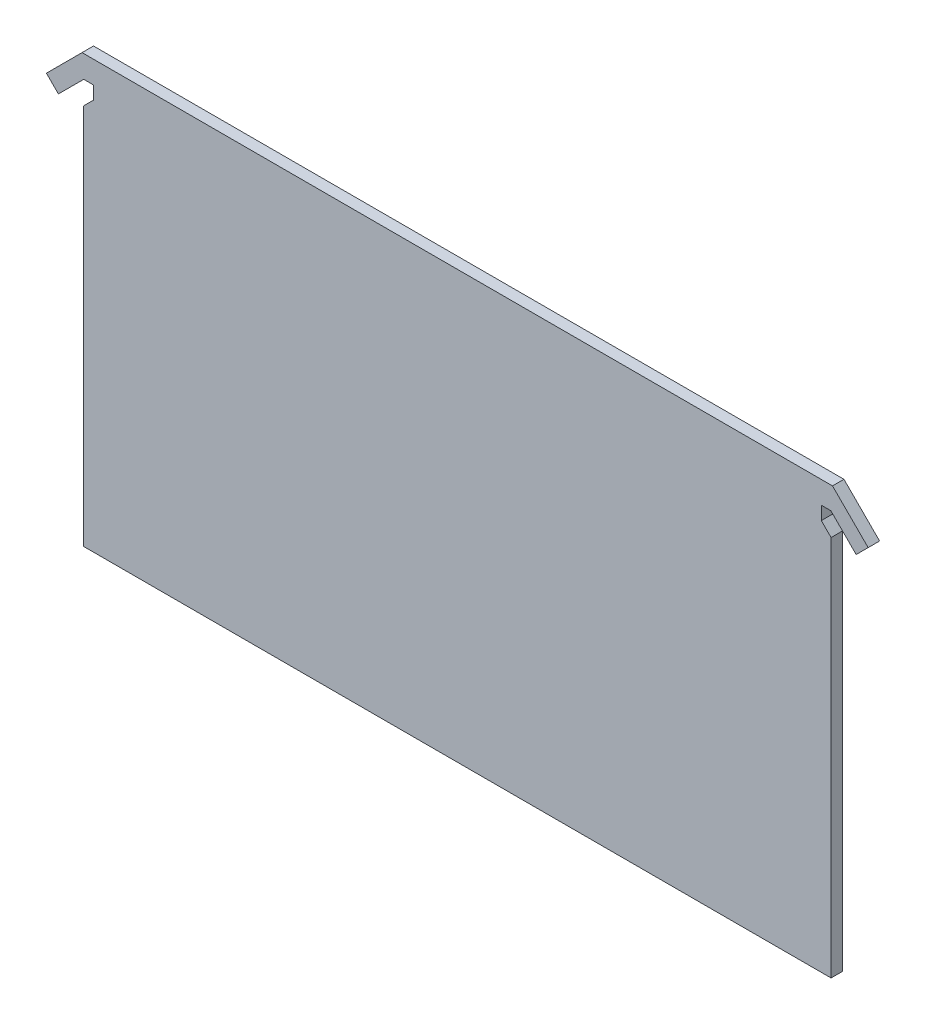
ISO-10303-21;
HEADER;
FILE_DESCRIPTION(('STEP AP214'),'2;1');
FILE_NAME('part.step','',(''),(''),'','','');
FILE_SCHEMA(('AUTOMOTIVE_DESIGN { 1 0 10303 214 1 1 1 1 }'));
ENDSEC;
DATA;
#1=APPLICATION_CONTEXT('core data for automotive mechanical design processes');
#2=APPLICATION_PROTOCOL_DEFINITION('international standard','automotive_design',2000,#1);
#3=PRODUCT_CONTEXT('',#1,'mechanical');
#4=PRODUCT('Part','Part','',(#3));
#5=PRODUCT_RELATED_PRODUCT_CATEGORY('part','',(#4));
#6=PRODUCT_DEFINITION_FORMATION('','',#4);
#7=PRODUCT_DEFINITION_CONTEXT('part definition',#1,'design');
#8=PRODUCT_DEFINITION('design','',#6,#7);
#9=PRODUCT_DEFINITION_SHAPE('','',#8);
#10=(LENGTH_UNIT() NAMED_UNIT(*) SI_UNIT(.MILLI.,.METRE.));
#11=(NAMED_UNIT(*) PLANE_ANGLE_UNIT() SI_UNIT($,.RADIAN.));
#12=(NAMED_UNIT(*) SI_UNIT($,.STERADIAN.) SOLID_ANGLE_UNIT());
#13=UNCERTAINTY_MEASURE_WITH_UNIT(LENGTH_MEASURE(1.E-05),#10,'distance_accuracy_value','');
#14=(GEOMETRIC_REPRESENTATION_CONTEXT(3) GLOBAL_UNCERTAINTY_ASSIGNED_CONTEXT((#13)) GLOBAL_UNIT_ASSIGNED_CONTEXT((#10,
#11,#12)) REPRESENTATION_CONTEXT('',''));
#15=CARTESIAN_POINT('',(0.,0.,0.));
#16=DIRECTION('',(0.,0.,1.));
#17=DIRECTION('',(1.,0.,0.));
#18=AXIS2_PLACEMENT_3D('',#15,#16,#17);
#19=CARTESIAN_POINT('',(-191.70632320588,121.016675198297,6.));
#20=DIRECTION('',(0.707106781186548,-0.707106781186548,0.));
#21=DIRECTION('',(0.707106781186548,0.707106781186548,0.));
#22=AXIS2_PLACEMENT_3D('',#19,#20,#21);
#23=PLANE('',#22);
#24=DIRECTION('',(-0.707106781186547,-0.707106781186547,0.));
#25=VECTOR('',#24,1.);
#26=CARTESIAN_POINT('',(-191.70632320588,121.016675198297,0.));
#27=LINE('',#26,#25);
#28=CARTESIAN_POINT('',(-191.70632320588,121.016675198297,0.));
#29=VERTEX_POINT('',#28);
#30=CARTESIAN_POINT('',(-210.391169282487,102.33182912169,0.));
#31=VERTEX_POINT('',#30);
#32=EDGE_CURVE('E181',#29,#31,#27,.T.);
#33=ORIENTED_EDGE('',*,*,#32,.T.);
#34=DIRECTION('',(0.,0.,-1.));
#35=VECTOR('',#34,1.);
#36=CARTESIAN_POINT('',(-210.391169282487,102.33182912169,6.));
#37=LINE('',#36,#35);
#38=CARTESIAN_POINT('',(-210.391169282487,102.33182912169,6.));
#39=VERTEX_POINT('',#38);
#40=EDGE_CURVE('E40',#39,#31,#37,.T.);
#41=ORIENTED_EDGE('',*,*,#40,.F.);
#42=DIRECTION('',(-0.707106781186547,-0.707106781186547,0.));
#43=VECTOR('',#42,1.);
#44=CARTESIAN_POINT('',(-191.70632320588,121.016675198297,6.));
#45=LINE('',#44,#43);
#46=CARTESIAN_POINT('',(-191.70632320588,121.016675198297,6.));
#47=VERTEX_POINT('',#46);
#48=EDGE_CURVE('E117',#47,#39,#45,.T.);
#49=ORIENTED_EDGE('',*,*,#48,.F.);
#50=DIRECTION('',(0.,0.,-1.));
#51=VECTOR('',#50,1.);
#52=CARTESIAN_POINT('',(-191.70632320588,121.016675198297,6.));
#53=LINE('',#52,#51);
#54=EDGE_CURVE('E11',#47,#29,#53,.T.);
#55=ORIENTED_EDGE('',*,*,#54,.T.);
#56=EDGE_LOOP('',(#33,#41,#49,#55));
#57=FACE_BOUND('',#56,.T.);
#58=ADVANCED_FACE('F32',(#57),#23,.F.);
#59=CARTESIAN_POINT('',(-204.103303894926,96.0439637341297,6.));
#60=DIRECTION('',(0.707106781186548,0.707106781186547,0.));
#61=DIRECTION('',(-0.707106781186547,0.707106781186548,0.));
#62=AXIS2_PLACEMENT_3D('',#59,#60,#61);
#63=PLANE('',#62);
#64=DIRECTION('',(0.707106781186547,-0.707106781186548,0.));
#65=VECTOR('',#64,1.);
#66=CARTESIAN_POINT('',(-204.103303894926,96.0439637341297,0.));
#67=LINE('',#66,#65);
#68=CARTESIAN_POINT('',(-204.103303894926,96.0439637341297,0.));
#69=VERTEX_POINT('',#68);
#70=EDGE_CURVE('E183',#31,#69,#67,.T.);
#71=ORIENTED_EDGE('',*,*,#70,.T.);
#72=DIRECTION('',(0.,0.,-1.));
#73=VECTOR('',#72,1.);
#74=CARTESIAN_POINT('',(-204.103303894926,96.0439637341297,6.));
#75=LINE('',#74,#73);
#76=CARTESIAN_POINT('',(-204.103303894926,96.0439637341297,6.));
#77=VERTEX_POINT('',#76);
#78=EDGE_CURVE('E240',#77,#69,#75,.T.);
#79=ORIENTED_EDGE('',*,*,#78,.F.);
#80=DIRECTION('',(0.707106781186547,-0.707106781186548,0.));
#81=VECTOR('',#80,1.);
#82=CARTESIAN_POINT('',(-204.103303894926,96.0439637341297,6.));
#83=LINE('',#82,#81);
#84=EDGE_CURVE('E248',#39,#77,#83,.T.);
#85=ORIENTED_EDGE('',*,*,#84,.F.);
#86=ORIENTED_EDGE('',*,*,#40,.T.);
#87=EDGE_LOOP('',(#71,#79,#85,#86));
#88=FACE_BOUND('',#87,.T.);
#89=ADVANCED_FACE('F246',(#88),#63,.F.);
#90=CARTESIAN_POINT('',(-190.830592430759,109.316675198297,6.));
#91=DIRECTION('',(-0.707106781186548,0.707106781186547,0.));
#92=DIRECTION('',(-0.707106781186547,-0.707106781186548,0.));
#93=AXIS2_PLACEMENT_3D('',#90,#91,#92);
#94=PLANE('',#93);
#95=DIRECTION('',(0.707106781186547,0.707106781186548,0.));
#96=VECTOR('',#95,1.);
#97=CARTESIAN_POINT('',(-190.830592430759,109.316675198297,0.));
#98=LINE('',#97,#96);
#99=CARTESIAN_POINT('',(-190.830592430759,109.316675198297,0.));
#100=VERTEX_POINT('',#99);
#101=EDGE_CURVE('E185',#69,#100,#98,.T.);
#102=ORIENTED_EDGE('',*,*,#101,.T.);
#103=DIRECTION('',(0.,0.,-1.));
#104=VECTOR('',#103,1.);
#105=CARTESIAN_POINT('',(-190.830592430759,109.316675198297,6.));
#106=LINE('',#105,#104);
#107=CARTESIAN_POINT('',(-190.830592430759,109.316675198297,6.));
#108=VERTEX_POINT('',#107);
#109=EDGE_CURVE('E237',#108,#100,#106,.T.);
#110=ORIENTED_EDGE('',*,*,#109,.F.);
#111=DIRECTION('',(0.707106781186547,0.707106781186548,0.));
#112=VECTOR('',#111,1.);
#113=CARTESIAN_POINT('',(-190.830592430759,109.316675198297,6.));
#114=LINE('',#113,#112);
#115=EDGE_CURVE('E264',#77,#108,#114,.T.);
#116=ORIENTED_EDGE('',*,*,#115,.F.);
#117=ORIENTED_EDGE('',*,*,#78,.T.);
#118=EDGE_LOOP('',(#102,#110,#116,#117));
#119=FACE_BOUND('',#118,.T.);
#120=ADVANCED_FACE('F255',(#119),#94,.F.);
#121=CARTESIAN_POINT('',(-190.830592430759,109.316675198297,6.));
#122=DIRECTION('',(0.,1.,0.));
#123=DIRECTION('',(0.,0.,1.));
#124=AXIS2_PLACEMENT_3D('',#121,#122,#123);
#125=PLANE('',#124);
#126=DIRECTION('',(1.,0.,0.));
#127=VECTOR('',#126,1.);
#128=CARTESIAN_POINT('',(-190.830592430759,109.316675198297,0.));
#129=LINE('',#128,#127);
#130=CARTESIAN_POINT('',(-185.830592430759,109.316675198297,0.));
#131=VERTEX_POINT('',#130);
#132=EDGE_CURVE('E187',#100,#131,#129,.T.);
#133=ORIENTED_EDGE('',*,*,#132,.T.);
#134=DIRECTION('',(0.,0.,-1.));
#135=VECTOR('',#134,1.);
#136=CARTESIAN_POINT('',(-185.830592430759,109.316675198297,6.));
#137=LINE('',#136,#135);
#138=CARTESIAN_POINT('',(-185.830592430759,109.316675198297,6.));
#139=VERTEX_POINT('',#138);
#140=EDGE_CURVE('E234',#139,#131,#137,.T.);
#141=ORIENTED_EDGE('',*,*,#140,.F.);
#142=DIRECTION('',(1.,0.,0.));
#143=VECTOR('',#142,1.);
#144=CARTESIAN_POINT('',(-190.830592430759,109.316675198297,6.));
#145=LINE('',#144,#143);
#146=EDGE_CURVE('E261',#108,#139,#145,.T.);
#147=ORIENTED_EDGE('',*,*,#146,.F.);
#148=ORIENTED_EDGE('',*,*,#109,.T.);
#149=EDGE_LOOP('',(#133,#141,#147,#148));
#150=FACE_BOUND('',#149,.T.);
#151=ADVANCED_FACE('F259',(#150),#125,.F.);
#152=CARTESIAN_POINT('',(-185.830592430759,102.316675198297,6.));
#153=DIRECTION('',(1.,0.,0.));
#154=DIRECTION('',(0.,0.,-1.));
#155=AXIS2_PLACEMENT_3D('',#152,#153,#154);
#156=PLANE('',#155);
#157=DIRECTION('',(0.,-1.,0.));
#158=VECTOR('',#157,1.);
#159=CARTESIAN_POINT('',(-185.830592430759,102.316675198297,0.));
#160=LINE('',#159,#158);
#161=CARTESIAN_POINT('',(-185.830592430759,102.316675198297,0.));
#162=VERTEX_POINT('',#161);
#163=EDGE_CURVE('E189',#131,#162,#160,.T.);
#164=ORIENTED_EDGE('',*,*,#163,.T.);
#165=DIRECTION('',(0.,0.,-1.));
#166=VECTOR('',#165,1.);
#167=CARTESIAN_POINT('',(-185.830592430759,102.316675198297,6.));
#168=LINE('',#167,#166);
#169=CARTESIAN_POINT('',(-185.830592430759,102.316675198297,6.));
#170=VERTEX_POINT('',#169);
#171=EDGE_CURVE('E231',#170,#162,#168,.T.);
#172=ORIENTED_EDGE('',*,*,#171,.F.);
#173=DIRECTION('',(0.,-1.,0.));
#174=VECTOR('',#173,1.);
#175=CARTESIAN_POINT('',(-185.830592430759,102.316675198297,6.));
#176=LINE('',#175,#174);
#177=EDGE_CURVE('E263',#139,#170,#176,.T.);
#178=ORIENTED_EDGE('',*,*,#177,.F.);
#179=ORIENTED_EDGE('',*,*,#140,.T.);
#180=EDGE_LOOP('',(#164,#172,#178,#179));
#181=FACE_BOUND('',#180,.T.);
#182=ADVANCED_FACE('F306',(#181),#156,.F.);
#183=CARTESIAN_POINT('',(-190.955336292633,97.1919313364233,6.));
#184=DIRECTION('',(0.707106781186547,-0.707106781186548,0.));
#185=DIRECTION('',(0.707106781186548,0.707106781186547,0.));
#186=AXIS2_PLACEMENT_3D('',#183,#184,#185);
#187=PLANE('',#186);
#188=DIRECTION('',(-0.707106781186548,-0.707106781186547,0.));
#189=VECTOR('',#188,1.);
#190=CARTESIAN_POINT('',(-190.955336292633,97.1919313364233,0.));
#191=LINE('',#190,#189);
#192=CARTESIAN_POINT('',(-190.955336292633,97.1919313364233,0.));
#193=VERTEX_POINT('',#192);
#194=EDGE_CURVE('E191',#162,#193,#191,.T.);
#195=ORIENTED_EDGE('',*,*,#194,.T.);
#196=DIRECTION('',(0.,0.,-1.));
#197=VECTOR('',#196,1.);
#198=CARTESIAN_POINT('',(-190.955336292633,97.1919313364233,6.));
#199=LINE('',#198,#197);
#200=CARTESIAN_POINT('',(-190.955336292633,97.1919313364233,6.));
#201=VERTEX_POINT('',#200);
#202=EDGE_CURVE('E228',#201,#193,#199,.T.);
#203=ORIENTED_EDGE('',*,*,#202,.F.);
#204=DIRECTION('',(-0.707106781186548,-0.707106781186547,0.));
#205=VECTOR('',#204,1.);
#206=CARTESIAN_POINT('',(-190.955336292633,97.1919313364233,6.));
#207=LINE('',#206,#205);
#208=EDGE_CURVE('E266',#170,#201,#207,.T.);
#209=ORIENTED_EDGE('',*,*,#208,.F.);
#210=ORIENTED_EDGE('',*,*,#171,.T.);
#211=EDGE_LOOP('',(#195,#203,#209,#210));
#212=FACE_BOUND('',#211,.T.);
#213=ADVANCED_FACE('F309',(#212),#187,.F.);
#214=CARTESIAN_POINT('',(-190.955336292633,97.1919313364233,6.));
#215=DIRECTION('',(1.,0.,0.));
#216=DIRECTION('',(0.,1.,0.));
#217=AXIS2_PLACEMENT_3D('',#214,#215,#216);
#218=PLANE('',#217);
#219=DIRECTION('',(0.,-1.,0.));
#220=VECTOR('',#219,1.);
#221=CARTESIAN_POINT('',(-190.955336292633,97.1919313364233,0.));
#222=LINE('',#221,#220);
#223=CARTESIAN_POINT('',(-190.955336292633,-102.795343439178,0.));
#224=VERTEX_POINT('',#223);
#225=EDGE_CURVE('E193',#193,#224,#222,.T.);
#226=ORIENTED_EDGE('',*,*,#225,.T.);
#227=DIRECTION('',(0.,0.,-1.));
#228=VECTOR('',#227,1.);
#229=CARTESIAN_POINT('',(-190.955336292633,-102.795343439178,6.));
#230=LINE('',#229,#228);
#231=CARTESIAN_POINT('',(-190.955336292633,-102.795343439178,6.));
#232=VERTEX_POINT('',#231);
#233=EDGE_CURVE('E225',#232,#224,#230,.T.);
#234=ORIENTED_EDGE('',*,*,#233,.F.);
#235=DIRECTION('',(0.,-1.,0.));
#236=VECTOR('',#235,1.);
#237=CARTESIAN_POINT('',(-190.955336292633,97.1919313364233,6.));
#238=LINE('',#237,#236);
#239=EDGE_CURVE('E272',#201,#232,#238,.T.);
#240=ORIENTED_EDGE('',*,*,#239,.F.);
#241=ORIENTED_EDGE('',*,*,#202,.T.);
#242=EDGE_LOOP('',(#226,#234,#240,#241));
#243=FACE_BOUND('',#242,.T.);
#244=ADVANCED_FACE('F313',(#243),#218,.F.);
#245=CARTESIAN_POINT('',(-190.955336292633,-102.795343439178,6.));
#246=DIRECTION('',(0.,1.,0.));
#247=DIRECTION('',(0.,0.,1.));
#248=AXIS2_PLACEMENT_3D('',#245,#246,#247);
#249=PLANE('',#248);
#250=DIRECTION('',(1.,0.,0.));
#251=VECTOR('',#250,1.);
#252=CARTESIAN_POINT('',(-190.955336292633,-102.795343439178,0.));
#253=LINE('',#252,#251);
#254=CARTESIAN_POINT('',(200.994151431102,-102.795343439178,0.));
#255=VERTEX_POINT('',#254);
#256=EDGE_CURVE('E195',#224,#255,#253,.T.);
#257=ORIENTED_EDGE('',*,*,#256,.T.);
#258=DIRECTION('',(0.,0.,-1.));
#259=VECTOR('',#258,1.);
#260=CARTESIAN_POINT('',(200.994151431102,-102.795343439178,6.));
#261=LINE('',#260,#259);
#262=CARTESIAN_POINT('',(200.994151431102,-102.795343439178,6.));
#263=VERTEX_POINT('',#262);
#264=EDGE_CURVE('E222',#263,#255,#261,.T.);
#265=ORIENTED_EDGE('',*,*,#264,.F.);
#266=DIRECTION('',(1.,0.,0.));
#267=VECTOR('',#266,1.);
#268=CARTESIAN_POINT('',(-190.955336292633,-102.795343439178,6.));
#269=LINE('',#268,#267);
#270=EDGE_CURVE('E274',#232,#263,#269,.T.);
#271=ORIENTED_EDGE('',*,*,#270,.F.);
#272=ORIENTED_EDGE('',*,*,#233,.T.);
#273=EDGE_LOOP('',(#257,#265,#271,#272));
#274=FACE_BOUND('',#273,.T.);
#275=ADVANCED_FACE('F317',(#274),#249,.F.);
#276=CARTESIAN_POINT('',(200.994151431102,97.1919313364233,6.));
#277=DIRECTION('',(-1.,0.,0.));
#278=DIRECTION('',(0.,0.,1.));
#279=AXIS2_PLACEMENT_3D('',#276,#277,#278);
#280=PLANE('',#279);
#281=DIRECTION('',(0.,1.,0.));
#282=VECTOR('',#281,1.);
#283=CARTESIAN_POINT('',(200.994151431102,97.1919313364233,0.));
#284=LINE('',#283,#282);
#285=CARTESIAN_POINT('',(200.994151431102,97.1919313364233,0.));
#286=VERTEX_POINT('',#285);
#287=EDGE_CURVE('E197',#255,#286,#284,.T.);
#288=ORIENTED_EDGE('',*,*,#287,.T.);
#289=DIRECTION('',(0.,0.,-1.));
#290=VECTOR('',#289,1.);
#291=CARTESIAN_POINT('',(200.994151431102,97.1919313364233,6.));
#292=LINE('',#291,#290);
#293=CARTESIAN_POINT('',(200.994151431102,97.1919313364233,6.));
#294=VERTEX_POINT('',#293);
#295=EDGE_CURVE('E219',#294,#286,#292,.T.);
#296=ORIENTED_EDGE('',*,*,#295,.F.);
#297=DIRECTION('',(0.,1.,0.));
#298=VECTOR('',#297,1.);
#299=CARTESIAN_POINT('',(200.994151431102,97.1919313364233,6.));
#300=LINE('',#299,#298);
#301=EDGE_CURVE('E276',#263,#294,#300,.T.);
#302=ORIENTED_EDGE('',*,*,#301,.F.);
#303=ORIENTED_EDGE('',*,*,#264,.T.);
#304=EDGE_LOOP('',(#288,#296,#302,#303));
#305=FACE_BOUND('',#304,.T.);
#306=ADVANCED_FACE('F321',(#305),#280,.F.);
#307=CARTESIAN_POINT('',(200.994151431102,97.1919313364233,6.));
#308=DIRECTION('',(-0.707106781186537,-0.707106781186558,0.));
#309=DIRECTION('',(0.707106781186558,-0.707106781186537,0.));
#310=AXIS2_PLACEMENT_3D('',#307,#308,#309);
#311=PLANE('',#310);
#312=DIRECTION('',(-0.707106781186558,0.707106781186537,0.));
#313=VECTOR('',#312,1.);
#314=CARTESIAN_POINT('',(200.994151431102,97.1919313364233,0.));
#315=LINE('',#314,#313);
#316=CARTESIAN_POINT('',(195.869407569229,102.316675198297,0.));
#317=VERTEX_POINT('',#316);
#318=EDGE_CURVE('E199',#286,#317,#315,.T.);
#319=ORIENTED_EDGE('',*,*,#318,.T.);
#320=DIRECTION('',(0.,0.,-1.));
#321=VECTOR('',#320,1.);
#322=CARTESIAN_POINT('',(195.869407569229,102.316675198297,6.));
#323=LINE('',#322,#321);
#324=CARTESIAN_POINT('',(195.869407569229,102.316675198297,6.));
#325=VERTEX_POINT('',#324);
#326=EDGE_CURVE('E216',#325,#317,#323,.T.);
#327=ORIENTED_EDGE('',*,*,#326,.F.);
#328=DIRECTION('',(-0.707106781186558,0.707106781186537,0.));
#329=VECTOR('',#328,1.);
#330=CARTESIAN_POINT('',(200.994151431102,97.1919313364233,6.));
#331=LINE('',#330,#329);
#332=EDGE_CURVE('E278',#294,#325,#331,.T.);
#333=ORIENTED_EDGE('',*,*,#332,.F.);
#334=ORIENTED_EDGE('',*,*,#295,.T.);
#335=EDGE_LOOP('',(#319,#327,#333,#334));
#336=FACE_BOUND('',#335,.T.);
#337=ADVANCED_FACE('F325',(#336),#311,.F.);
#338=CARTESIAN_POINT('',(195.869407569229,102.316675198297,6.));
#339=DIRECTION('',(-1.,0.,0.));
#340=DIRECTION('',(0.,0.,1.));
#341=AXIS2_PLACEMENT_3D('',#338,#339,#340);
#342=PLANE('',#341);
#343=DIRECTION('',(0.,1.,0.));
#344=VECTOR('',#343,1.);
#345=CARTESIAN_POINT('',(195.869407569229,102.316675198297,0.));
#346=LINE('',#345,#344);
#347=CARTESIAN_POINT('',(195.869407569229,109.316675198297,0.));
#348=VERTEX_POINT('',#347);
#349=EDGE_CURVE('E201',#317,#348,#346,.T.);
#350=ORIENTED_EDGE('',*,*,#349,.T.);
#351=DIRECTION('',(0.,0.,-1.));
#352=VECTOR('',#351,1.);
#353=CARTESIAN_POINT('',(195.869407569229,109.316675198297,6.));
#354=LINE('',#353,#352);
#355=CARTESIAN_POINT('',(195.869407569229,109.316675198297,6.));
#356=VERTEX_POINT('',#355);
#357=EDGE_CURVE('E213',#356,#348,#354,.T.);
#358=ORIENTED_EDGE('',*,*,#357,.F.);
#359=DIRECTION('',(0.,1.,0.));
#360=VECTOR('',#359,1.);
#361=CARTESIAN_POINT('',(195.869407569229,102.316675198297,6.));
#362=LINE('',#361,#360);
#363=EDGE_CURVE('E280',#325,#356,#362,.T.);
#364=ORIENTED_EDGE('',*,*,#363,.F.);
#365=ORIENTED_EDGE('',*,*,#326,.T.);
#366=EDGE_LOOP('',(#350,#358,#364,#365));
#367=FACE_BOUND('',#366,.T.);
#368=ADVANCED_FACE('F286',(#367),#342,.F.);
#369=CARTESIAN_POINT('',(200.869407569228,109.316675198297,6.));
#370=DIRECTION('',(0.,1.,0.));
#371=DIRECTION('',(0.,0.,1.));
#372=AXIS2_PLACEMENT_3D('',#369,#370,#371);
#373=PLANE('',#372);
#374=DIRECTION('',(1.,0.,0.));
#375=VECTOR('',#374,1.);
#376=CARTESIAN_POINT('',(200.869407569228,109.316675198297,0.));
#377=LINE('',#376,#375);
#378=CARTESIAN_POINT('',(200.869407569228,109.316675198297,0.));
#379=VERTEX_POINT('',#378);
#380=EDGE_CURVE('E203',#348,#379,#377,.T.);
#381=ORIENTED_EDGE('',*,*,#380,.T.);
#382=DIRECTION('',(0.,0.,-1.));
#383=VECTOR('',#382,1.);
#384=CARTESIAN_POINT('',(200.869407569228,109.316675198297,6.));
#385=LINE('',#384,#383);
#386=CARTESIAN_POINT('',(200.869407569228,109.316675198297,6.));
#387=VERTEX_POINT('',#386);
#388=EDGE_CURVE('E170',#387,#379,#385,.T.);
#389=ORIENTED_EDGE('',*,*,#388,.F.);
#390=DIRECTION('',(1.,0.,0.));
#391=VECTOR('',#390,1.);
#392=CARTESIAN_POINT('',(200.869407569228,109.316675198297,6.));
#393=LINE('',#392,#391);
#394=EDGE_CURVE('E161',#356,#387,#393,.T.);
#395=ORIENTED_EDGE('',*,*,#394,.F.);
#396=ORIENTED_EDGE('',*,*,#357,.T.);
#397=EDGE_LOOP('',(#381,#389,#395,#396));
#398=FACE_BOUND('',#397,.T.);
#399=ADVANCED_FACE('F290',(#398),#373,.F.);
#400=CARTESIAN_POINT('',(200.869407569228,109.316675198297,6.));
#401=DIRECTION('',(0.707106781186548,0.707106781186547,0.));
#402=DIRECTION('',(-0.707106781186547,0.707106781186548,0.));
#403=AXIS2_PLACEMENT_3D('',#400,#401,#402);
#404=PLANE('',#403);
#405=DIRECTION('',(0.707106781186547,-0.707106781186548,0.));
#406=VECTOR('',#405,1.);
#407=CARTESIAN_POINT('',(200.869407569228,109.316675198297,0.));
#408=LINE('',#407,#406);
#409=CARTESIAN_POINT('',(214.142119033396,96.0439637341296,0.));
#410=VERTEX_POINT('',#409);
#411=EDGE_CURVE('E169',#379,#410,#408,.T.);
#412=ORIENTED_EDGE('',*,*,#411,.T.);
#413=DIRECTION('',(0.,0.,-1.));
#414=VECTOR('',#413,1.);
#415=CARTESIAN_POINT('',(214.142119033396,96.0439637341296,6.));
#416=LINE('',#415,#414);
#417=CARTESIAN_POINT('',(214.142119033396,96.0439637341296,6.));
#418=VERTEX_POINT('',#417);
#419=EDGE_CURVE('E166',#418,#410,#416,.T.);
#420=ORIENTED_EDGE('',*,*,#419,.F.);
#421=DIRECTION('',(0.707106781186547,-0.707106781186548,0.));
#422=VECTOR('',#421,1.);
#423=CARTESIAN_POINT('',(200.869407569228,109.316675198297,6.));
#424=LINE('',#423,#422);
#425=EDGE_CURVE('E155',#387,#418,#424,.T.);
#426=ORIENTED_EDGE('',*,*,#425,.F.);
#427=ORIENTED_EDGE('',*,*,#388,.T.);
#428=EDGE_LOOP('',(#412,#420,#426,#427));
#429=FACE_BOUND('',#428,.T.);
#430=ADVANCED_FACE('F167',(#429),#404,.F.);
#431=CARTESIAN_POINT('',(214.142119033396,96.0439637341296,6.));
#432=DIRECTION('',(-0.707106781186548,0.707106781186547,0.));
#433=DIRECTION('',(-0.707106781186547,-0.707106781186548,0.));
#434=AXIS2_PLACEMENT_3D('',#431,#432,#433);
#435=PLANE('',#434);
#436=DIRECTION('',(0.707106781186547,0.707106781186548,0.));
#437=VECTOR('',#436,1.);
#438=CARTESIAN_POINT('',(214.142119033396,96.0439637341296,0.));
#439=LINE('',#438,#437);
#440=CARTESIAN_POINT('',(220.429984420957,102.33182912169,0.));
#441=VERTEX_POINT('',#440);
#442=EDGE_CURVE('E102',#410,#441,#439,.T.);
#443=ORIENTED_EDGE('',*,*,#442,.T.);
#444=DIRECTION('',(0.,0.,-1.));
#445=VECTOR('',#444,1.);
#446=CARTESIAN_POINT('',(220.429984420957,102.33182912169,6.));
#447=LINE('',#446,#445);
#448=CARTESIAN_POINT('',(220.429984420957,102.33182912169,6.));
#449=VERTEX_POINT('',#448);
#450=EDGE_CURVE('E171',#449,#441,#447,.T.);
#451=ORIENTED_EDGE('',*,*,#450,.F.);
#452=DIRECTION('',(0.707106781186547,0.707106781186548,0.));
#453=VECTOR('',#452,1.);
#454=CARTESIAN_POINT('',(214.142119033396,96.0439637341296,6.));
#455=LINE('',#454,#453);
#456=EDGE_CURVE('E159',#418,#449,#455,.T.);
#457=ORIENTED_EDGE('',*,*,#456,.F.);
#458=ORIENTED_EDGE('',*,*,#419,.T.);
#459=EDGE_LOOP('',(#443,#451,#457,#458));
#460=FACE_BOUND('',#459,.T.);
#461=ADVANCED_FACE('F173',(#460),#435,.F.);
#462=CARTESIAN_POINT('',(201.74513834435,121.016675198297,6.));
#463=DIRECTION('',(-0.707106781186548,-0.707106781186547,0.));
#464=DIRECTION('',(0.707106781186547,-0.707106781186548,0.));
#465=AXIS2_PLACEMENT_3D('',#462,#463,#464);
#466=PLANE('',#465);
#467=DIRECTION('',(-0.707106781186547,0.707106781186548,0.));
#468=VECTOR('',#467,1.);
#469=CARTESIAN_POINT('',(201.74513834435,121.016675198297,0.));
#470=LINE('',#469,#468);
#471=CARTESIAN_POINT('',(201.74513834435,121.016675198297,0.));
#472=VERTEX_POINT('',#471);
#473=EDGE_CURVE('E207',#441,#472,#470,.T.);
#474=ORIENTED_EDGE('',*,*,#473,.T.);
#475=DIRECTION('',(0.,0.,-1.));
#476=VECTOR('',#475,1.);
#477=CARTESIAN_POINT('',(201.74513834435,121.016675198297,6.));
#478=LINE('',#477,#476);
#479=CARTESIAN_POINT('',(201.74513834435,121.016675198297,6.));
#480=VERTEX_POINT('',#479);
#481=EDGE_CURVE('E177',#480,#472,#478,.T.);
#482=ORIENTED_EDGE('',*,*,#481,.F.);
#483=DIRECTION('',(-0.707106781186547,0.707106781186548,0.));
#484=VECTOR('',#483,1.);
#485=CARTESIAN_POINT('',(201.74513834435,121.016675198297,6.));
#486=LINE('',#485,#484);
#487=EDGE_CURVE('E175',#449,#480,#486,.T.);
#488=ORIENTED_EDGE('',*,*,#487,.F.);
#489=ORIENTED_EDGE('',*,*,#450,.T.);
#490=EDGE_LOOP('',(#474,#482,#488,#489));
#491=FACE_BOUND('',#490,.T.);
#492=ADVANCED_FACE('F293',(#491),#466,.F.);
#493=CARTESIAN_POINT('',(163.741243393348,121.016675198297,6.));
#494=DIRECTION('',(0.,-1.,0.));
#495=DIRECTION('',(0.,0.,-1.));
#496=AXIS2_PLACEMENT_3D('',#493,#494,#495);
#497=PLANE('',#496);
#498=DIRECTION('',(-1.,0.,0.));
#499=VECTOR('',#498,1.);
#500=CARTESIAN_POINT('',(163.741243393348,121.016675198297,0.));
#501=LINE('',#500,#499);
#502=EDGE_CURVE('E109',#472,#29,#501,.T.);
#503=ORIENTED_EDGE('',*,*,#502,.T.);
#504=ORIENTED_EDGE('',*,*,#54,.F.);
#505=DIRECTION('',(-1.,0.,0.));
#506=VECTOR('',#505,1.);
#507=CARTESIAN_POINT('',(-153.702428254878,121.016675198297,6.));
#508=LINE('',#507,#506);
#509=EDGE_CURVE('E48',#480,#47,#508,.T.);
#510=ORIENTED_EDGE('',*,*,#509,.F.);
#511=ORIENTED_EDGE('',*,*,#481,.T.);
#512=EDGE_LOOP('',(#503,#504,#510,#511));
#513=FACE_BOUND('',#512,.T.);
#514=ADVANCED_FACE('F294',(#513),#497,.F.);
#515=CARTESIAN_POINT('',(-185.830592430759,121.016675198297,6.));
#516=DIRECTION('',(0.,0.,-1.));
#517=DIRECTION('',(-1.,0.,0.));
#518=AXIS2_PLACEMENT_3D('',#515,#516,#517);
#519=PLANE('',#518);
#520=ORIENTED_EDGE('',*,*,#509,.T.);
#521=ORIENTED_EDGE('',*,*,#48,.T.);
#522=ORIENTED_EDGE('',*,*,#84,.T.);
#523=ORIENTED_EDGE('',*,*,#115,.T.);
#524=ORIENTED_EDGE('',*,*,#146,.T.);
#525=ORIENTED_EDGE('',*,*,#177,.T.);
#526=ORIENTED_EDGE('',*,*,#208,.T.);
#527=ORIENTED_EDGE('',*,*,#239,.T.);
#528=ORIENTED_EDGE('',*,*,#270,.T.);
#529=ORIENTED_EDGE('',*,*,#301,.T.);
#530=ORIENTED_EDGE('',*,*,#332,.T.);
#531=ORIENTED_EDGE('',*,*,#363,.T.);
#532=ORIENTED_EDGE('',*,*,#394,.T.);
#533=ORIENTED_EDGE('',*,*,#425,.T.);
#534=ORIENTED_EDGE('',*,*,#456,.T.);
#535=ORIENTED_EDGE('',*,*,#487,.T.);
#536=EDGE_LOOP('',(#520,#521,#522,#523,#524,#525,#526,#527,#528,#529,#530,#531,#532,#533,#534,#535));
#537=FACE_BOUND('',#536,.T.);
#538=ADVANCED_FACE('F157',(#537),#519,.F.);
#539=CARTESIAN_POINT('',(-185.830592430759,121.016675198297,0.));
#540=DIRECTION('',(0.,0.,-1.));
#541=DIRECTION('',(-1.,0.,0.));
#542=AXIS2_PLACEMENT_3D('',#539,#540,#541);
#543=PLANE('',#542);
#544=ORIENTED_EDGE('',*,*,#32,.F.);
#545=ORIENTED_EDGE('',*,*,#502,.F.);
#546=ORIENTED_EDGE('',*,*,#473,.F.);
#547=ORIENTED_EDGE('',*,*,#442,.F.);
#548=ORIENTED_EDGE('',*,*,#411,.F.);
#549=ORIENTED_EDGE('',*,*,#380,.F.);
#550=ORIENTED_EDGE('',*,*,#349,.F.);
#551=ORIENTED_EDGE('',*,*,#318,.F.);
#552=ORIENTED_EDGE('',*,*,#287,.F.);
#553=ORIENTED_EDGE('',*,*,#256,.F.);
#554=ORIENTED_EDGE('',*,*,#225,.F.);
#555=ORIENTED_EDGE('',*,*,#194,.F.);
#556=ORIENTED_EDGE('',*,*,#163,.F.);
#557=ORIENTED_EDGE('',*,*,#132,.F.);
#558=ORIENTED_EDGE('',*,*,#101,.F.);
#559=ORIENTED_EDGE('',*,*,#70,.F.);
#560=EDGE_LOOP('',(#544,#545,#546,#547,#548,#549,#550,#551,#552,#553,#554,#555,#556,#557,#558,#559));
#561=FACE_BOUND('',#560,.T.);
#562=ADVANCED_FACE('F250',(#561),#543,.T.);
#563=CLOSED_SHELL('',(#58,#89,#120,#151,#182,#213,#244,#275,#306,#337,#368,#399,#430,#461,#492,
#514,#538,#562));
#564=MANIFOLD_SOLID_BREP('B2',#563);
#565=ADVANCED_BREP_SHAPE_REPRESENTATION('',(#18,#564),#14);
#566=SHAPE_DEFINITION_REPRESENTATION(#9,#565);
ENDSEC;
END-ISO-10303-21;
